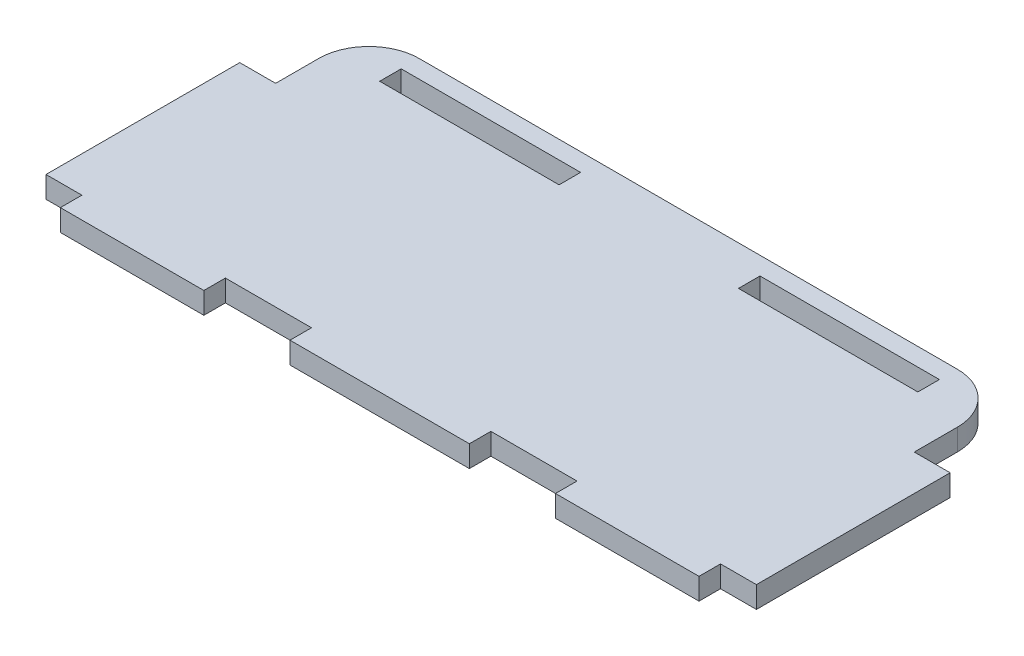
ISO-10303-21;
HEADER;
FILE_DESCRIPTION(('STEP AP214'),'2;1');
FILE_NAME('part.step','',(''),(''),'','','');
FILE_SCHEMA(('AUTOMOTIVE_DESIGN { 1 0 10303 214 1 1 1 1 }'));
ENDSEC;
DATA;
#1=APPLICATION_CONTEXT('core data for automotive mechanical design processes');
#2=APPLICATION_PROTOCOL_DEFINITION('international standard','automotive_design',2000,#1);
#3=PRODUCT_CONTEXT('',#1,'mechanical');
#4=PRODUCT('Part','Part','',(#3));
#5=PRODUCT_RELATED_PRODUCT_CATEGORY('part','',(#4));
#6=PRODUCT_DEFINITION_FORMATION('','',#4);
#7=PRODUCT_DEFINITION_CONTEXT('part definition',#1,'design');
#8=PRODUCT_DEFINITION('design','',#6,#7);
#9=PRODUCT_DEFINITION_SHAPE('','',#8);
#10=(LENGTH_UNIT() NAMED_UNIT(*) SI_UNIT(.MILLI.,.METRE.));
#11=(NAMED_UNIT(*) PLANE_ANGLE_UNIT() SI_UNIT($,.RADIAN.));
#12=(NAMED_UNIT(*) SI_UNIT($,.STERADIAN.) SOLID_ANGLE_UNIT());
#13=UNCERTAINTY_MEASURE_WITH_UNIT(LENGTH_MEASURE(1.E-05),#10,'distance_accuracy_value','');
#14=(GEOMETRIC_REPRESENTATION_CONTEXT(3) GLOBAL_UNCERTAINTY_ASSIGNED_CONTEXT((#13)) GLOBAL_UNIT_ASSIGNED_CONTEXT((#10,
#11,#12)) REPRESENTATION_CONTEXT('',''));
#15=CARTESIAN_POINT('',(0.,0.,0.));
#16=DIRECTION('',(0.,0.,1.));
#17=DIRECTION('',(1.,0.,0.));
#18=AXIS2_PLACEMENT_3D('',#15,#16,#17);
#19=CARTESIAN_POINT('',(-44.5,-24.,119.050547443573));
#20=DIRECTION('',(1.,0.,0.));
#21=DIRECTION('',(0.,1.,0.));
#22=AXIS2_PLACEMENT_3D('',#19,#20,#21);
#23=PLANE('',#22);
#24=DIRECTION('',(0.,0.,-1.));
#25=VECTOR('',#24,1.);
#26=CARTESIAN_POINT('',(-44.5,-21.,119.050547443573));
#27=LINE('',#26,#25);
#28=CARTESIAN_POINT('',(-44.5,-21.0000000000001,0.));
#29=VERTEX_POINT('',#28);
#30=CARTESIAN_POINT('',(-44.5,-21.,-5.99999999999994));
#31=VERTEX_POINT('',#30);
#32=EDGE_CURVE('E374',#29,#31,#27,.T.);
#33=ORIENTED_EDGE('',*,*,#32,.T.);
#34=DIRECTION('',(0.,1.,0.));
#35=VECTOR('',#34,1.);
#36=CARTESIAN_POINT('',(-44.5,-24.,-5.99999999999999));
#37=LINE('',#36,#35);
#38=CARTESIAN_POINT('',(-44.5,-24.,-5.99999999999994));
#39=VERTEX_POINT('',#38);
#40=EDGE_CURVE('E58',#31,#39,#37,.F.);
#41=ORIENTED_EDGE('',*,*,#40,.T.);
#42=DIRECTION('',(0.,0.,-1.));
#43=VECTOR('',#42,1.);
#44=CARTESIAN_POINT('',(-44.5,-24.,119.050547443573));
#45=LINE('',#44,#43);
#46=CARTESIAN_POINT('',(-44.5,-24.0000000000001,0.));
#47=VERTEX_POINT('',#46);
#48=EDGE_CURVE('E364',#47,#39,#45,.T.);
#49=ORIENTED_EDGE('',*,*,#48,.F.);
#50=DIRECTION('',(0.,1.,0.));
#51=VECTOR('',#50,1.);
#52=CARTESIAN_POINT('',(-44.5,-21.0000000000001,0.));
#53=LINE('',#52,#51);
#54=EDGE_CURVE('E298',#47,#29,#53,.T.);
#55=ORIENTED_EDGE('',*,*,#54,.T.);
#56=EDGE_LOOP('',(#33,#41,#49,#55));
#57=FACE_BOUND('',#56,.T.);
#58=ADVANCED_FACE('F35',(#57),#23,.F.);
#59=CARTESIAN_POINT('',(44.5,-24.,119.050547443573));
#60=DIRECTION('',(-1.,0.,0.));
#61=DIRECTION('',(0.,-1.,0.));
#62=AXIS2_PLACEMENT_3D('',#59,#60,#61);
#63=PLANE('',#62);
#64=DIRECTION('',(0.,0.,-1.));
#65=VECTOR('',#64,1.);
#66=CARTESIAN_POINT('',(44.5,-24.,119.050547443573));
#67=LINE('',#66,#65);
#68=CARTESIAN_POINT('',(44.5,-24.,0.));
#69=VERTEX_POINT('',#68);
#70=CARTESIAN_POINT('',(44.5,-24.,-5.99999999999994));
#71=VERTEX_POINT('',#70);
#72=EDGE_CURVE('E406',#69,#71,#67,.T.);
#73=ORIENTED_EDGE('',*,*,#72,.T.);
#74=DIRECTION('',(0.,-1.,0.));
#75=VECTOR('',#74,1.);
#76=CARTESIAN_POINT('',(44.5,-24.,-5.99999999999999));
#77=LINE('',#76,#75);
#78=CARTESIAN_POINT('',(44.5,-21.,-5.99999999999994));
#79=VERTEX_POINT('',#78);
#80=EDGE_CURVE('E11',#71,#79,#77,.F.);
#81=ORIENTED_EDGE('',*,*,#80,.T.);
#82=DIRECTION('',(0.,0.,-1.));
#83=VECTOR('',#82,1.);
#84=CARTESIAN_POINT('',(44.5,-21.,119.050547443573));
#85=LINE('',#84,#83);
#86=CARTESIAN_POINT('',(44.5,-21.,0.));
#87=VERTEX_POINT('',#86);
#88=EDGE_CURVE('E380',#87,#79,#85,.T.);
#89=ORIENTED_EDGE('',*,*,#88,.F.);
#90=DIRECTION('',(0.,1.,0.));
#91=VECTOR('',#90,1.);
#92=CARTESIAN_POINT('',(44.5,-21.0000000000001,0.));
#93=LINE('',#92,#91);
#94=EDGE_CURVE('E325',#69,#87,#93,.T.);
#95=ORIENTED_EDGE('',*,*,#94,.F.);
#96=EDGE_LOOP('',(#73,#81,#89,#95));
#97=FACE_BOUND('',#96,.T.);
#98=ADVANCED_FACE('F555',(#97),#63,.F.);
#99=DIRECTION('',(0.,-1.,0.));
#100=VECTOR('',#99,1.);
#101=CARTESIAN_POINT('',(44.5,-21.0000000000001,27.));
#102=LINE('',#101,#100);
#103=CARTESIAN_POINT('',(44.5,-21.,27.0000000000001));
#104=VERTEX_POINT('',#103);
#105=CARTESIAN_POINT('',(44.5,-24.0000000000001,27.));
#106=VERTEX_POINT('',#105);
#107=EDGE_CURVE('E445',#104,#106,#102,.T.);
#108=ORIENTED_EDGE('',*,*,#107,.F.);
#109=CARTESIAN_POINT('',(44.5,-21.,30.));
#110=VERTEX_POINT('',#109);
#111=EDGE_CURVE('E403',#110,#104,#85,.T.);
#112=ORIENTED_EDGE('',*,*,#111,.F.);
#113=DIRECTION('',(0.,-1.,0.));
#114=VECTOR('',#113,1.);
#115=CARTESIAN_POINT('',(44.5,-24.,30.));
#116=LINE('',#115,#114);
#117=CARTESIAN_POINT('',(44.5,-24.,30.));
#118=VERTEX_POINT('',#117);
#119=EDGE_CURVE('E426',#110,#118,#116,.T.);
#120=ORIENTED_EDGE('',*,*,#119,.T.);
#121=EDGE_CURVE('E755',#118,#106,#67,.T.);
#122=ORIENTED_EDGE('',*,*,#121,.T.);
#123=EDGE_LOOP('',(#108,#112,#120,#122));
#124=FACE_BOUND('',#123,.T.);
#125=ADVANCED_FACE('F560',(#124),#63,.F.);
#126=CARTESIAN_POINT('',(0.,-35.5,30.));
#127=DIRECTION('',(0.,0.,-1.));
#128=DIRECTION('',(-1.,0.,0.));
#129=AXIS2_PLACEMENT_3D('',#126,#127,#128);
#130=PLANE('',#129);
#131=DIRECTION('',(1.,0.,0.));
#132=VECTOR('',#131,1.);
#133=CARTESIAN_POINT('',(-44.5,-21.,30.));
#134=LINE('',#133,#132);
#135=CARTESIAN_POINT('',(-12.5,-21.,30.));
#136=VERTEX_POINT('',#135);
#137=CARTESIAN_POINT('',(12.5,-21.,30.));
#138=VERTEX_POINT('',#137);
#139=EDGE_CURVE('E427',#136,#138,#134,.T.);
#140=ORIENTED_EDGE('',*,*,#139,.F.);
#141=DIRECTION('',(0.,-1.,0.));
#142=VECTOR('',#141,1.);
#143=CARTESIAN_POINT('',(-12.5,-35.5,30.));
#144=LINE('',#143,#142);
#145=CARTESIAN_POINT('',(-12.5,-24.,30.));
#146=VERTEX_POINT('',#145);
#147=EDGE_CURVE('E409',#136,#146,#144,.T.);
#148=ORIENTED_EDGE('',*,*,#147,.T.);
#149=DIRECTION('',(-1.,0.,0.));
#150=VECTOR('',#149,1.);
#151=CARTESIAN_POINT('',(-44.5,-24.,30.));
#152=LINE('',#151,#150);
#153=CARTESIAN_POINT('',(12.5,-24.,30.));
#154=VERTEX_POINT('',#153);
#155=EDGE_CURVE('E515',#154,#146,#152,.T.);
#156=ORIENTED_EDGE('',*,*,#155,.F.);
#157=DIRECTION('',(0.,1.,0.));
#158=VECTOR('',#157,1.);
#159=CARTESIAN_POINT('',(12.5,-35.5,30.));
#160=LINE('',#159,#158);
#161=EDGE_CURVE('E421',#154,#138,#160,.T.);
#162=ORIENTED_EDGE('',*,*,#161,.T.);
#163=EDGE_LOOP('',(#140,#148,#156,#162));
#164=FACE_BOUND('',#163,.T.);
#165=ADVANCED_FACE('F571',(#164),#130,.F.);
#166=CARTESIAN_POINT('',(24.5,-21.,30.));
#167=VERTEX_POINT('',#166);
#168=EDGE_CURVE('E428',#167,#110,#134,.T.);
#169=ORIENTED_EDGE('',*,*,#168,.F.);
#170=DIRECTION('',(0.,-1.,0.));
#171=VECTOR('',#170,1.);
#172=CARTESIAN_POINT('',(24.5,-35.5,30.));
#173=LINE('',#172,#171);
#174=CARTESIAN_POINT('',(24.5,-24.,30.));
#175=VERTEX_POINT('',#174);
#176=EDGE_CURVE('E418',#167,#175,#173,.T.);
#177=ORIENTED_EDGE('',*,*,#176,.T.);
#178=EDGE_CURVE('E513',#118,#175,#152,.T.);
#179=ORIENTED_EDGE('',*,*,#178,.F.);
#180=ORIENTED_EDGE('',*,*,#119,.F.);
#181=EDGE_LOOP('',(#169,#177,#179,#180));
#182=FACE_BOUND('',#181,.T.);
#183=ADVANCED_FACE('F572',(#182),#130,.F.);
#184=CARTESIAN_POINT('',(-44.5,-21.,119.050547443573));
#185=DIRECTION('',(0.,-1.,0.));
#186=DIRECTION('',(0.,0.,-1.));
#187=AXIS2_PLACEMENT_3D('',#184,#185,#186);
#188=PLANE('',#187);
#189=DIRECTION('',(1.,0.,0.));
#190=VECTOR('',#189,1.);
#191=CARTESIAN_POINT('',(12.5,-21.,-7.5));
#192=LINE('',#191,#190);
#193=CARTESIAN_POINT('',(12.5,-21.,-7.49999999999999));
#194=VERTEX_POINT('',#193);
#195=CARTESIAN_POINT('',(37.5,-21.,-7.5));
#196=VERTEX_POINT('',#195);
#197=EDGE_CURVE('E250',#194,#196,#192,.T.);
#198=ORIENTED_EDGE('',*,*,#197,.F.);
#199=DIRECTION('',(0.,0.,1.));
#200=VECTOR('',#199,1.);
#201=CARTESIAN_POINT('',(12.5,-21.,-10.5));
#202=LINE('',#201,#200);
#203=CARTESIAN_POINT('',(12.5,-21.,-10.5));
#204=VERTEX_POINT('',#203);
#205=EDGE_CURVE('E255',#204,#194,#202,.T.);
#206=ORIENTED_EDGE('',*,*,#205,.F.);
#207=DIRECTION('',(-1.,0.,0.));
#208=VECTOR('',#207,1.);
#209=CARTESIAN_POINT('',(12.5,-21.,-10.5));
#210=LINE('',#209,#208);
#211=CARTESIAN_POINT('',(37.5,-21.,-10.5));
#212=VERTEX_POINT('',#211);
#213=EDGE_CURVE('E260',#212,#204,#210,.T.);
#214=ORIENTED_EDGE('',*,*,#213,.F.);
#215=DIRECTION('',(0.,0.,-1.));
#216=VECTOR('',#215,1.);
#217=CARTESIAN_POINT('',(37.5,-21.,-10.5));
#218=LINE('',#217,#216);
#219=EDGE_CURVE('E239',#196,#212,#218,.T.);
#220=ORIENTED_EDGE('',*,*,#219,.F.);
#221=EDGE_LOOP('',(#198,#206,#214,#220));
#222=FACE_BOUND('',#221,.T.);
#223=DIRECTION('',(1.,0.,0.));
#224=VECTOR('',#223,1.);
#225=CARTESIAN_POINT('',(-37.5,-21.,-7.5));
#226=LINE('',#225,#224);
#227=CARTESIAN_POINT('',(-37.5,-21.,-7.49999999999999));
#228=VERTEX_POINT('',#227);
#229=CARTESIAN_POINT('',(-12.5,-21.,-7.5));
#230=VERTEX_POINT('',#229);
#231=EDGE_CURVE('E272',#228,#230,#226,.T.);
#232=ORIENTED_EDGE('',*,*,#231,.F.);
#233=DIRECTION('',(0.,0.,1.));
#234=VECTOR('',#233,1.);
#235=CARTESIAN_POINT('',(-37.5,-21.,-10.5));
#236=LINE('',#235,#234);
#237=CARTESIAN_POINT('',(-37.5,-21.,-10.5));
#238=VERTEX_POINT('',#237);
#239=EDGE_CURVE('E268',#238,#228,#236,.T.);
#240=ORIENTED_EDGE('',*,*,#239,.F.);
#241=DIRECTION('',(-1.,0.,0.));
#242=VECTOR('',#241,1.);
#243=CARTESIAN_POINT('',(-37.5,-21.,-10.5));
#244=LINE('',#243,#242);
#245=CARTESIAN_POINT('',(-12.5,-21.,-10.5));
#246=VERTEX_POINT('',#245);
#247=EDGE_CURVE('E278',#246,#238,#244,.T.);
#248=ORIENTED_EDGE('',*,*,#247,.F.);
#249=DIRECTION('',(0.,0.,-1.));
#250=VECTOR('',#249,1.);
#251=CARTESIAN_POINT('',(-12.5,-21.,-10.5));
#252=LINE('',#251,#250);
#253=EDGE_CURVE('E275',#230,#246,#252,.T.);
#254=ORIENTED_EDGE('',*,*,#253,.F.);
#255=EDGE_LOOP('',(#232,#240,#248,#254));
#256=FACE_BOUND('',#255,.T.);
#257=DIRECTION('',(1.,0.,0.));
#258=VECTOR('',#257,1.);
#259=CARTESIAN_POINT('',(-44.5,-21.,-13.));
#260=LINE('',#259,#258);
#261=CARTESIAN_POINT('',(-37.5,-21.,-13.));
#262=VERTEX_POINT('',#261);
#263=CARTESIAN_POINT('',(37.5,-21.,-13.));
#264=VERTEX_POINT('',#263);
#265=EDGE_CURVE('E284',#262,#264,#260,.T.);
#266=ORIENTED_EDGE('',*,*,#265,.F.);
#267=CARTESIAN_POINT('',(-37.5,-21.,-6.));
#268=DIRECTION('',(0.,-1.,0.));
#269=DIRECTION('',(0.,0.,-1.));
#270=AXIS2_PLACEMENT_3D('',#267,#268,#269);
#271=CIRCLE('',#270,7.);
#272=EDGE_CURVE('E359',#262,#31,#271,.F.);
#273=ORIENTED_EDGE('',*,*,#272,.T.);
#274=ORIENTED_EDGE('',*,*,#32,.F.);
#275=DIRECTION('',(1.,0.,0.));
#276=VECTOR('',#275,1.);
#277=CARTESIAN_POINT('',(-49.5,-21.0000000000001,0.));
#278=LINE('',#277,#276);
#279=CARTESIAN_POINT('',(-49.5,-21.0000000000001,0.));
#280=VERTEX_POINT('',#279);
#281=EDGE_CURVE('E312',#280,#29,#278,.T.);
#282=ORIENTED_EDGE('',*,*,#281,.F.);
#283=DIRECTION('',(0.,0.,1.));
#284=VECTOR('',#283,1.);
#285=CARTESIAN_POINT('',(-49.5,-21.0000000000001,0.));
#286=LINE('',#285,#284);
#287=CARTESIAN_POINT('',(-49.5,-21.0000000000001,27.));
#288=VERTEX_POINT('',#287);
#289=EDGE_CURVE('E309',#280,#288,#286,.T.);
#290=ORIENTED_EDGE('',*,*,#289,.T.);
#291=DIRECTION('',(1.,0.,0.));
#292=VECTOR('',#291,1.);
#293=CARTESIAN_POINT('',(-49.5,-21.0000000000001,27.));
#294=LINE('',#293,#292);
#295=CARTESIAN_POINT('',(-44.5,-21.0000000000001,27.));
#296=VERTEX_POINT('',#295);
#297=EDGE_CURVE('E531',#288,#296,#294,.T.);
#298=ORIENTED_EDGE('',*,*,#297,.T.);
#299=CARTESIAN_POINT('',(-44.5,-21.,30.));
#300=VERTEX_POINT('',#299);
#301=EDGE_CURVE('E376',#300,#296,#27,.T.);
#302=ORIENTED_EDGE('',*,*,#301,.F.);
#303=CARTESIAN_POINT('',(-24.5,-21.,30.));
#304=VERTEX_POINT('',#303);
#305=EDGE_CURVE('E424',#300,#304,#134,.T.);
#306=ORIENTED_EDGE('',*,*,#305,.T.);
#307=DIRECTION('',(0.,0.,1.));
#308=VECTOR('',#307,1.);
#309=CARTESIAN_POINT('',(-24.5,-21.,30.));
#310=LINE('',#309,#308);
#311=CARTESIAN_POINT('',(-24.5,-21.,27.));
#312=VERTEX_POINT('',#311);
#313=EDGE_CURVE('E480',#312,#304,#310,.T.);
#314=ORIENTED_EDGE('',*,*,#313,.F.);
#315=DIRECTION('',(-1.,0.,0.));
#316=VECTOR('',#315,1.);
#317=CARTESIAN_POINT('',(-12.5,-21.,27.));
#318=LINE('',#317,#316);
#319=CARTESIAN_POINT('',(-12.5,-21.,27.));
#320=VERTEX_POINT('',#319);
#321=EDGE_CURVE('E474',#320,#312,#318,.T.);
#322=ORIENTED_EDGE('',*,*,#321,.F.);
#323=DIRECTION('',(0.,0.,-1.));
#324=VECTOR('',#323,1.);
#325=CARTESIAN_POINT('',(-12.5,-21.,30.));
#326=LINE('',#325,#324);
#327=EDGE_CURVE('E454',#136,#320,#326,.T.);
#328=ORIENTED_EDGE('',*,*,#327,.F.);
#329=ORIENTED_EDGE('',*,*,#139,.T.);
#330=DIRECTION('',(0.,0.,1.));
#331=VECTOR('',#330,1.);
#332=CARTESIAN_POINT('',(12.5,-21.,30.));
#333=LINE('',#332,#331);
#334=CARTESIAN_POINT('',(12.5,-21.,27.));
#335=VERTEX_POINT('',#334);
#336=EDGE_CURVE('E502',#335,#138,#333,.T.);
#337=ORIENTED_EDGE('',*,*,#336,.F.);
#338=DIRECTION('',(-1.,0.,0.));
#339=VECTOR('',#338,1.);
#340=CARTESIAN_POINT('',(24.5,-21.,27.));
#341=LINE('',#340,#339);
#342=CARTESIAN_POINT('',(24.5,-21.,27.));
#343=VERTEX_POINT('',#342);
#344=EDGE_CURVE('E499',#343,#335,#341,.T.);
#345=ORIENTED_EDGE('',*,*,#344,.F.);
#346=DIRECTION('',(0.,0.,-1.));
#347=VECTOR('',#346,1.);
#348=CARTESIAN_POINT('',(24.5,-21.,30.));
#349=LINE('',#348,#347);
#350=EDGE_CURVE('E496',#167,#343,#349,.T.);
#351=ORIENTED_EDGE('',*,*,#350,.F.);
#352=ORIENTED_EDGE('',*,*,#168,.T.);
#353=ORIENTED_EDGE('',*,*,#111,.T.);
#354=DIRECTION('',(-1.,0.,0.));
#355=VECTOR('',#354,1.);
#356=CARTESIAN_POINT('',(49.5,-21.0000000000001,27.));
#357=LINE('',#356,#355);
#358=CARTESIAN_POINT('',(49.5,-21.0000000000001,27.));
#359=VERTEX_POINT('',#358);
#360=EDGE_CURVE('E463',#359,#104,#357,.T.);
#361=ORIENTED_EDGE('',*,*,#360,.F.);
#362=DIRECTION('',(0.,0.,1.));
#363=VECTOR('',#362,1.);
#364=CARTESIAN_POINT('',(49.5,-21.0000000000001,0.));
#365=LINE('',#364,#363);
#366=CARTESIAN_POINT('',(49.5,-21.0000000000001,0.));
#367=VERTEX_POINT('',#366);
#368=EDGE_CURVE('E766',#367,#359,#365,.T.);
#369=ORIENTED_EDGE('',*,*,#368,.F.);
#370=DIRECTION('',(-1.,0.,0.));
#371=VECTOR('',#370,1.);
#372=CARTESIAN_POINT('',(49.5,-21.0000000000001,0.));
#373=LINE('',#372,#371);
#374=EDGE_CURVE('E468',#367,#87,#373,.T.);
#375=ORIENTED_EDGE('',*,*,#374,.T.);
#376=ORIENTED_EDGE('',*,*,#88,.T.);
#377=CARTESIAN_POINT('',(37.5,-21.,-6.));
#378=DIRECTION('',(0.,-1.,0.));
#379=DIRECTION('',(0.,0.,-1.));
#380=AXIS2_PLACEMENT_3D('',#377,#378,#379);
#381=CIRCLE('',#380,7.);
#382=EDGE_CURVE('E357',#79,#264,#381,.F.);
#383=ORIENTED_EDGE('',*,*,#382,.T.);
#384=EDGE_LOOP('',(#266,#273,#274,#282,#290,#298,#302,#306,#314,#322,#328,#329,#337,#345,#351,
#352,#353,#361,#369,#375,#376,#383));
#385=FACE_BOUND('',#384,.T.);
#386=ADVANCED_FACE('F257',(#222,#256,#385),#188,.F.);
#387=CARTESIAN_POINT('',(-44.5,-24.,119.050547443573));
#388=DIRECTION('',(0.,1.,0.));
#389=DIRECTION('',(0.,0.,1.));
#390=AXIS2_PLACEMENT_3D('',#387,#388,#389);
#391=PLANE('',#390);
#392=DIRECTION('',(-1.,0.,0.));
#393=VECTOR('',#392,1.);
#394=CARTESIAN_POINT('',(-44.5,-24.,-10.5));
#395=LINE('',#394,#393);
#396=CARTESIAN_POINT('',(37.5,-24.,-10.5));
#397=VERTEX_POINT('',#396);
#398=CARTESIAN_POINT('',(12.5,-24.,-10.5));
#399=VERTEX_POINT('',#398);
#400=EDGE_CURVE('E345',#397,#399,#395,.T.);
#401=ORIENTED_EDGE('',*,*,#400,.T.);
#402=DIRECTION('',(0.,0.,1.));
#403=VECTOR('',#402,1.);
#404=CARTESIAN_POINT('',(12.5,-24.,119.050547443573));
#405=LINE('',#404,#403);
#406=CARTESIAN_POINT('',(12.5,-24.,-7.5));
#407=VERTEX_POINT('',#406);
#408=EDGE_CURVE('E348',#399,#407,#405,.T.);
#409=ORIENTED_EDGE('',*,*,#408,.T.);
#410=DIRECTION('',(1.,0.,0.));
#411=VECTOR('',#410,1.);
#412=CARTESIAN_POINT('',(-44.5,-24.,-7.49999999999999));
#413=LINE('',#412,#411);
#414=CARTESIAN_POINT('',(37.5,-24.,-7.49999999999999));
#415=VERTEX_POINT('',#414);
#416=EDGE_CURVE('E342',#407,#415,#413,.T.);
#417=ORIENTED_EDGE('',*,*,#416,.T.);
#418=DIRECTION('',(0.,0.,-1.));
#419=VECTOR('',#418,1.);
#420=CARTESIAN_POINT('',(37.5,-24.,119.050547443573));
#421=LINE('',#420,#419);
#422=EDGE_CURVE('E242',#415,#397,#421,.T.);
#423=ORIENTED_EDGE('',*,*,#422,.T.);
#424=EDGE_LOOP('',(#401,#409,#417,#423));
#425=FACE_BOUND('',#424,.T.);
#426=DIRECTION('',(-1.,0.,0.));
#427=VECTOR('',#426,1.);
#428=CARTESIAN_POINT('',(-44.5,-24.,-10.5));
#429=LINE('',#428,#427);
#430=CARTESIAN_POINT('',(-12.5,-24.,-10.5));
#431=VERTEX_POINT('',#430);
#432=CARTESIAN_POINT('',(-37.5,-24.,-10.5));
#433=VERTEX_POINT('',#432);
#434=EDGE_CURVE('E336',#431,#433,#429,.T.);
#435=ORIENTED_EDGE('',*,*,#434,.T.);
#436=DIRECTION('',(0.,0.,1.));
#437=VECTOR('',#436,1.);
#438=CARTESIAN_POINT('',(-37.5,-24.,119.050547443573));
#439=LINE('',#438,#437);
#440=CARTESIAN_POINT('',(-37.5,-24.,-7.5));
#441=VERTEX_POINT('',#440);
#442=EDGE_CURVE('E339',#433,#441,#439,.T.);
#443=ORIENTED_EDGE('',*,*,#442,.T.);
#444=DIRECTION('',(1.,0.,0.));
#445=VECTOR('',#444,1.);
#446=CARTESIAN_POINT('',(-44.5,-24.,-7.49999999999999));
#447=LINE('',#446,#445);
#448=CARTESIAN_POINT('',(-12.5,-24.,-7.49999999999999));
#449=VERTEX_POINT('',#448);
#450=EDGE_CURVE('E329',#441,#449,#447,.T.);
#451=ORIENTED_EDGE('',*,*,#450,.T.);
#452=DIRECTION('',(0.,0.,-1.));
#453=VECTOR('',#452,1.);
#454=CARTESIAN_POINT('',(-12.5,-24.,119.050547443573));
#455=LINE('',#454,#453);
#456=EDGE_CURVE('E332',#449,#431,#455,.T.);
#457=ORIENTED_EDGE('',*,*,#456,.T.);
#458=EDGE_LOOP('',(#435,#443,#451,#457));
#459=FACE_BOUND('',#458,.T.);
#460=ORIENTED_EDGE('',*,*,#48,.T.);
#461=CARTESIAN_POINT('',(-37.5,-24.,-6.));
#462=DIRECTION('',(0.,1.,0.));
#463=DIRECTION('',(0.,0.,1.));
#464=AXIS2_PLACEMENT_3D('',#461,#462,#463);
#465=CIRCLE('',#464,7.);
#466=CARTESIAN_POINT('',(-37.5,-24.,-13.));
#467=VERTEX_POINT('',#466);
#468=EDGE_CURVE('E43',#39,#467,#465,.F.);
#469=ORIENTED_EDGE('',*,*,#468,.T.);
#470=DIRECTION('',(-1.,0.,0.));
#471=VECTOR('',#470,1.);
#472=CARTESIAN_POINT('',(-44.5,-24.,-13.));
#473=LINE('',#472,#471);
#474=CARTESIAN_POINT('',(37.5,-24.,-13.));
#475=VERTEX_POINT('',#474);
#476=EDGE_CURVE('E294',#475,#467,#473,.T.);
#477=ORIENTED_EDGE('',*,*,#476,.F.);
#478=CARTESIAN_POINT('',(37.5,-24.,-6.));
#479=DIRECTION('',(0.,1.,0.));
#480=DIRECTION('',(0.,0.,1.));
#481=AXIS2_PLACEMENT_3D('',#478,#479,#480);
#482=CIRCLE('',#481,7.);
#483=EDGE_CURVE('E50',#475,#71,#482,.F.);
#484=ORIENTED_EDGE('',*,*,#483,.T.);
#485=ORIENTED_EDGE('',*,*,#72,.F.);
#486=DIRECTION('',(-1.,0.,0.));
#487=VECTOR('',#486,1.);
#488=CARTESIAN_POINT('',(49.5,-24.0000000000001,0.));
#489=LINE('',#488,#487);
#490=CARTESIAN_POINT('',(49.5,-24.0000000000001,0.));
#491=VERTEX_POINT('',#490);
#492=EDGE_CURVE('E437',#491,#69,#489,.T.);
#493=ORIENTED_EDGE('',*,*,#492,.F.);
#494=DIRECTION('',(0.,0.,-1.));
#495=VECTOR('',#494,1.);
#496=CARTESIAN_POINT('',(49.5,-24.0000000000001,0.));
#497=LINE('',#496,#495);
#498=CARTESIAN_POINT('',(49.5,-24.0000000000001,27.));
#499=VERTEX_POINT('',#498);
#500=EDGE_CURVE('E441',#499,#491,#497,.T.);
#501=ORIENTED_EDGE('',*,*,#500,.F.);
#502=DIRECTION('',(-1.,0.,0.));
#503=VECTOR('',#502,1.);
#504=CARTESIAN_POINT('',(49.5,-24.0000000000001,27.));
#505=LINE('',#504,#503);
#506=EDGE_CURVE('E440',#499,#106,#505,.T.);
#507=ORIENTED_EDGE('',*,*,#506,.T.);
#508=ORIENTED_EDGE('',*,*,#121,.F.);
#509=ORIENTED_EDGE('',*,*,#178,.T.);
#510=DIRECTION('',(0.,0.,-1.));
#511=VECTOR('',#510,1.);
#512=CARTESIAN_POINT('',(24.5000000000002,-24.,119.050547443573));
#513=LINE('',#512,#511);
#514=CARTESIAN_POINT('',(24.5,-24.,27.));
#515=VERTEX_POINT('',#514);
#516=EDGE_CURVE('E377',#175,#515,#513,.T.);
#517=ORIENTED_EDGE('',*,*,#516,.T.);
#518=DIRECTION('',(-1.,0.,0.));
#519=VECTOR('',#518,1.);
#520=CARTESIAN_POINT('',(-44.5000000000001,-24.,27.0000000000001));
#521=LINE('',#520,#519);
#522=CARTESIAN_POINT('',(12.5,-24.,27.));
#523=VERTEX_POINT('',#522);
#524=EDGE_CURVE('E415',#515,#523,#521,.T.);
#525=ORIENTED_EDGE('',*,*,#524,.T.);
#526=DIRECTION('',(0.,0.,1.));
#527=VECTOR('',#526,1.);
#528=CARTESIAN_POINT('',(12.5,-24.,119.050547443573));
#529=LINE('',#528,#527);
#530=EDGE_CURVE('E383',#523,#154,#529,.T.);
#531=ORIENTED_EDGE('',*,*,#530,.T.);
#532=ORIENTED_EDGE('',*,*,#155,.T.);
#533=DIRECTION('',(0.,0.,-1.));
#534=VECTOR('',#533,1.);
#535=CARTESIAN_POINT('',(-12.5000000000001,-24.,119.050547443573));
#536=LINE('',#535,#534);
#537=CARTESIAN_POINT('',(-12.5,-24.,27.));
#538=VERTEX_POINT('',#537);
#539=EDGE_CURVE('E493',#146,#538,#536,.T.);
#540=ORIENTED_EDGE('',*,*,#539,.T.);
#541=DIRECTION('',(-1.,0.,0.));
#542=VECTOR('',#541,1.);
#543=CARTESIAN_POINT('',(-44.5,-24.,27.));
#544=LINE('',#543,#542);
#545=CARTESIAN_POINT('',(-24.5,-24.,27.));
#546=VERTEX_POINT('',#545);
#547=EDGE_CURVE('E333',#538,#546,#544,.T.);
#548=ORIENTED_EDGE('',*,*,#547,.T.);
#549=DIRECTION('',(0.,0.,1.));
#550=VECTOR('',#549,1.);
#551=CARTESIAN_POINT('',(-24.5,-24.,119.050547443573));
#552=LINE('',#551,#550);
#553=CARTESIAN_POINT('',(-24.5,-24.,30.));
#554=VERTEX_POINT('',#553);
#555=EDGE_CURVE('E489',#546,#554,#552,.T.);
#556=ORIENTED_EDGE('',*,*,#555,.T.);
#557=CARTESIAN_POINT('',(-44.5,-24.,30.));
#558=VERTEX_POINT('',#557);
#559=EDGE_CURVE('E512',#554,#558,#152,.T.);
#560=ORIENTED_EDGE('',*,*,#559,.T.);
#561=CARTESIAN_POINT('',(-44.5,-24.,27.0000000000001));
#562=VERTEX_POINT('',#561);
#563=EDGE_CURVE('E432',#558,#562,#45,.T.);
#564=ORIENTED_EDGE('',*,*,#563,.T.);
#565=DIRECTION('',(1.,0.,0.));
#566=VECTOR('',#565,1.);
#567=CARTESIAN_POINT('',(-49.5,-24.0000000000001,27.));
#568=LINE('',#567,#566);
#569=CARTESIAN_POINT('',(-49.5,-24.0000000000001,27.));
#570=VERTEX_POINT('',#569);
#571=EDGE_CURVE('E326',#570,#562,#568,.T.);
#572=ORIENTED_EDGE('',*,*,#571,.F.);
#573=DIRECTION('',(0.,0.,-1.));
#574=VECTOR('',#573,1.);
#575=CARTESIAN_POINT('',(-49.5,-24.0000000000001,0.));
#576=LINE('',#575,#574);
#577=CARTESIAN_POINT('',(-49.5,-24.0000000000001,0.));
#578=VERTEX_POINT('',#577);
#579=EDGE_CURVE('E302',#570,#578,#576,.T.);
#580=ORIENTED_EDGE('',*,*,#579,.T.);
#581=DIRECTION('',(1.,0.,0.));
#582=VECTOR('',#581,1.);
#583=CARTESIAN_POINT('',(-49.5,-24.0000000000001,0.));
#584=LINE('',#583,#582);
#585=EDGE_CURVE('E323',#578,#47,#584,.T.);
#586=ORIENTED_EDGE('',*,*,#585,.T.);
#587=EDGE_LOOP('',(#460,#469,#477,#484,#485,#493,#501,#507,#508,#509,#517,#525,#531,#532,#540,
#548,#556,#560,#564,#572,#580,#586));
#588=FACE_BOUND('',#587,.T.);
#589=ADVANCED_FACE('F363',(#425,#459,#588),#391,.F.);
#590=ORIENTED_EDGE('',*,*,#301,.T.);
#591=DIRECTION('',(0.,-1.,0.));
#592=VECTOR('',#591,1.);
#593=CARTESIAN_POINT('',(-44.5,-21.0000000000001,27.));
#594=LINE('',#593,#592);
#595=EDGE_CURVE('E303',#296,#562,#594,.T.);
#596=ORIENTED_EDGE('',*,*,#595,.T.);
#597=ORIENTED_EDGE('',*,*,#563,.F.);
#598=DIRECTION('',(0.,1.,0.));
#599=VECTOR('',#598,1.);
#600=CARTESIAN_POINT('',(-44.5,-24.,30.));
#601=LINE('',#600,#599);
#602=EDGE_CURVE('E392',#558,#300,#601,.T.);
#603=ORIENTED_EDGE('',*,*,#602,.T.);
#604=EDGE_LOOP('',(#590,#596,#597,#603));
#605=FACE_BOUND('',#604,.T.);
#606=ADVANCED_FACE('F527',(#605),#23,.F.);
#607=ORIENTED_EDGE('',*,*,#559,.F.);
#608=DIRECTION('',(0.,1.,0.));
#609=VECTOR('',#608,1.);
#610=CARTESIAN_POINT('',(-24.5,-35.5,30.));
#611=LINE('',#610,#609);
#612=EDGE_CURVE('E412',#554,#304,#611,.T.);
#613=ORIENTED_EDGE('',*,*,#612,.T.);
#614=ORIENTED_EDGE('',*,*,#305,.F.);
#615=ORIENTED_EDGE('',*,*,#602,.F.);
#616=EDGE_LOOP('',(#607,#613,#614,#615));
#617=FACE_BOUND('',#616,.T.);
#618=ADVANCED_FACE('F523',(#617),#130,.F.);
#619=CARTESIAN_POINT('',(24.5,-31.,27.));
#620=DIRECTION('',(0.,0.,-1.));
#621=DIRECTION('',(-1.,0.,0.));
#622=AXIS2_PLACEMENT_3D('',#619,#620,#621);
#623=PLANE('',#622);
#624=DIRECTION('',(0.,1.,0.));
#625=VECTOR('',#624,1.);
#626=CARTESIAN_POINT('',(24.5,-31.,27.));
#627=LINE('',#626,#625);
#628=EDGE_CURVE('E505',#515,#343,#627,.T.);
#629=ORIENTED_EDGE('',*,*,#628,.T.);
#630=ORIENTED_EDGE('',*,*,#344,.T.);
#631=DIRECTION('',(0.,1.,0.));
#632=VECTOR('',#631,1.);
#633=CARTESIAN_POINT('',(12.5,-31.,27.));
#634=LINE('',#633,#632);
#635=EDGE_CURVE('E506',#523,#335,#634,.T.);
#636=ORIENTED_EDGE('',*,*,#635,.F.);
#637=ORIENTED_EDGE('',*,*,#524,.F.);
#638=EDGE_LOOP('',(#629,#630,#636,#637));
#639=FACE_BOUND('',#638,.T.);
#640=ADVANCED_FACE('F569',(#639),#623,.F.);
#641=CARTESIAN_POINT('',(24.5,-31.,30.));
#642=DIRECTION('',(1.,0.,0.));
#643=DIRECTION('',(0.,0.,-1.));
#644=AXIS2_PLACEMENT_3D('',#641,#642,#643);
#645=PLANE('',#644);
#646=ORIENTED_EDGE('',*,*,#176,.F.);
#647=ORIENTED_EDGE('',*,*,#350,.T.);
#648=ORIENTED_EDGE('',*,*,#628,.F.);
#649=ORIENTED_EDGE('',*,*,#516,.F.);
#650=EDGE_LOOP('',(#646,#647,#648,#649));
#651=FACE_BOUND('',#650,.T.);
#652=ADVANCED_FACE('F580',(#651),#645,.F.);
#653=CARTESIAN_POINT('',(12.5,-31.,30.));
#654=DIRECTION('',(-1.,0.,0.));
#655=DIRECTION('',(0.,0.,1.));
#656=AXIS2_PLACEMENT_3D('',#653,#654,#655);
#657=PLANE('',#656);
#658=ORIENTED_EDGE('',*,*,#635,.T.);
#659=ORIENTED_EDGE('',*,*,#336,.T.);
#660=ORIENTED_EDGE('',*,*,#161,.F.);
#661=ORIENTED_EDGE('',*,*,#530,.F.);
#662=EDGE_LOOP('',(#658,#659,#660,#661));
#663=FACE_BOUND('',#662,.T.);
#664=ADVANCED_FACE('F583',(#663),#657,.F.);
#665=CARTESIAN_POINT('',(-12.5,-31.,27.));
#666=DIRECTION('',(0.,0.,-1.));
#667=DIRECTION('',(-1.,0.,0.));
#668=AXIS2_PLACEMENT_3D('',#665,#666,#667);
#669=PLANE('',#668);
#670=DIRECTION('',(0.,1.,0.));
#671=VECTOR('',#670,1.);
#672=CARTESIAN_POINT('',(-12.5,-31.,27.));
#673=LINE('',#672,#671);
#674=EDGE_CURVE('E484',#538,#320,#673,.T.);
#675=ORIENTED_EDGE('',*,*,#674,.T.);
#676=ORIENTED_EDGE('',*,*,#321,.T.);
#677=DIRECTION('',(0.,1.,0.));
#678=VECTOR('',#677,1.);
#679=CARTESIAN_POINT('',(-24.5,-31.,27.));
#680=LINE('',#679,#678);
#681=EDGE_CURVE('E487',#546,#312,#680,.T.);
#682=ORIENTED_EDGE('',*,*,#681,.F.);
#683=ORIENTED_EDGE('',*,*,#547,.F.);
#684=EDGE_LOOP('',(#675,#676,#682,#683));
#685=FACE_BOUND('',#684,.T.);
#686=ADVANCED_FACE('F590',(#685),#669,.F.);
#687=CARTESIAN_POINT('',(-12.5,-31.,30.));
#688=DIRECTION('',(1.,0.,0.));
#689=DIRECTION('',(0.,0.,-1.));
#690=AXIS2_PLACEMENT_3D('',#687,#688,#689);
#691=PLANE('',#690);
#692=ORIENTED_EDGE('',*,*,#147,.F.);
#693=ORIENTED_EDGE('',*,*,#327,.T.);
#694=ORIENTED_EDGE('',*,*,#674,.F.);
#695=ORIENTED_EDGE('',*,*,#539,.F.);
#696=EDGE_LOOP('',(#692,#693,#694,#695));
#697=FACE_BOUND('',#696,.T.);
#698=ADVANCED_FACE('F592',(#697),#691,.F.);
#699=CARTESIAN_POINT('',(-24.5,-31.,30.));
#700=DIRECTION('',(-1.,0.,0.));
#701=DIRECTION('',(0.,0.,1.));
#702=AXIS2_PLACEMENT_3D('',#699,#700,#701);
#703=PLANE('',#702);
#704=ORIENTED_EDGE('',*,*,#681,.T.);
#705=ORIENTED_EDGE('',*,*,#313,.T.);
#706=ORIENTED_EDGE('',*,*,#612,.F.);
#707=ORIENTED_EDGE('',*,*,#555,.F.);
#708=EDGE_LOOP('',(#704,#705,#706,#707));
#709=FACE_BOUND('',#708,.T.);
#710=ADVANCED_FACE('F595',(#709),#703,.F.);
#711=CARTESIAN_POINT('',(49.5,-21.0000000000001,0.));
#712=DIRECTION('',(0.,0.,1.));
#713=DIRECTION('',(1.,0.,0.));
#714=AXIS2_PLACEMENT_3D('',#711,#712,#713);
#715=PLANE('',#714);
#716=ORIENTED_EDGE('',*,*,#94,.T.);
#717=ORIENTED_EDGE('',*,*,#374,.F.);
#718=DIRECTION('',(0.,1.,0.));
#719=VECTOR('',#718,1.);
#720=CARTESIAN_POINT('',(49.5,-21.0000000000001,0.));
#721=LINE('',#720,#719);
#722=EDGE_CURVE('E460',#491,#367,#721,.T.);
#723=ORIENTED_EDGE('',*,*,#722,.F.);
#724=ORIENTED_EDGE('',*,*,#492,.T.);
#725=EDGE_LOOP('',(#716,#717,#723,#724));
#726=FACE_BOUND('',#725,.T.);
#727=ADVANCED_FACE('F600',(#726),#715,.F.);
#728=CARTESIAN_POINT('',(49.5,-21.0000000000001,27.));
#729=DIRECTION('',(0.,0.,-1.));
#730=DIRECTION('',(-1.,0.,0.));
#731=AXIS2_PLACEMENT_3D('',#728,#729,#730);
#732=PLANE('',#731);
#733=ORIENTED_EDGE('',*,*,#107,.T.);
#734=ORIENTED_EDGE('',*,*,#506,.F.);
#735=DIRECTION('',(0.,-1.,0.));
#736=VECTOR('',#735,1.);
#737=CARTESIAN_POINT('',(49.5,-21.0000000000001,27.));
#738=LINE('',#737,#736);
#739=EDGE_CURVE('E765',#359,#499,#738,.T.);
#740=ORIENTED_EDGE('',*,*,#739,.F.);
#741=ORIENTED_EDGE('',*,*,#360,.T.);
#742=EDGE_LOOP('',(#733,#734,#740,#741));
#743=FACE_BOUND('',#742,.T.);
#744=ADVANCED_FACE('F604',(#743),#732,.F.);
#745=CARTESIAN_POINT('',(49.5,0.,0.));
#746=DIRECTION('',(-1.,0.,0.));
#747=DIRECTION('',(0.,0.,1.));
#748=AXIS2_PLACEMENT_3D('',#745,#746,#747);
#749=PLANE('',#748);
#750=ORIENTED_EDGE('',*,*,#722,.T.);
#751=ORIENTED_EDGE('',*,*,#368,.T.);
#752=ORIENTED_EDGE('',*,*,#739,.T.);
#753=ORIENTED_EDGE('',*,*,#500,.T.);
#754=EDGE_LOOP('',(#750,#751,#752,#753));
#755=FACE_BOUND('',#754,.T.);
#756=ADVANCED_FACE('F608',(#755),#749,.F.);
#757=CARTESIAN_POINT('',(-49.5,-21.0000000000001,0.));
#758=DIRECTION('',(0.,0.,-1.));
#759=DIRECTION('',(-1.,0.,0.));
#760=AXIS2_PLACEMENT_3D('',#757,#758,#759);
#761=PLANE('',#760);
#762=ORIENTED_EDGE('',*,*,#54,.F.);
#763=ORIENTED_EDGE('',*,*,#585,.F.);
#764=DIRECTION('',(0.,1.,0.));
#765=VECTOR('',#764,1.);
#766=CARTESIAN_POINT('',(-49.5,-21.0000000000001,0.));
#767=LINE('',#766,#765);
#768=EDGE_CURVE('E299',#578,#280,#767,.T.);
#769=ORIENTED_EDGE('',*,*,#768,.T.);
#770=ORIENTED_EDGE('',*,*,#281,.T.);
#771=EDGE_LOOP('',(#762,#763,#769,#770));
#772=FACE_BOUND('',#771,.T.);
#773=ADVANCED_FACE('F540',(#772),#761,.T.);
#774=CARTESIAN_POINT('',(-49.5,-21.0000000000001,27.));
#775=DIRECTION('',(0.,0.,1.));
#776=DIRECTION('',(1.,0.,0.));
#777=AXIS2_PLACEMENT_3D('',#774,#775,#776);
#778=PLANE('',#777);
#779=ORIENTED_EDGE('',*,*,#595,.F.);
#780=ORIENTED_EDGE('',*,*,#297,.F.);
#781=DIRECTION('',(0.,-1.,0.));
#782=VECTOR('',#781,1.);
#783=CARTESIAN_POINT('',(-49.5,-21.0000000000001,27.));
#784=LINE('',#783,#782);
#785=EDGE_CURVE('E306',#288,#570,#784,.T.);
#786=ORIENTED_EDGE('',*,*,#785,.T.);
#787=ORIENTED_EDGE('',*,*,#571,.T.);
#788=EDGE_LOOP('',(#779,#780,#786,#787));
#789=FACE_BOUND('',#788,.T.);
#790=ADVANCED_FACE('F530',(#789),#778,.T.);
#791=CARTESIAN_POINT('',(-49.5,0.,0.));
#792=DIRECTION('',(1.,0.,0.));
#793=DIRECTION('',(0.,0.,1.));
#794=AXIS2_PLACEMENT_3D('',#791,#792,#793);
#795=PLANE('',#794);
#796=ORIENTED_EDGE('',*,*,#768,.F.);
#797=ORIENTED_EDGE('',*,*,#579,.F.);
#798=ORIENTED_EDGE('',*,*,#785,.F.);
#799=ORIENTED_EDGE('',*,*,#289,.F.);
#800=EDGE_LOOP('',(#796,#797,#798,#799));
#801=FACE_BOUND('',#800,.T.);
#802=ADVANCED_FACE('F544',(#801),#795,.F.);
#803=CARTESIAN_POINT('',(0.,0.,-13.));
#804=DIRECTION('',(0.,0.,1.));
#805=DIRECTION('',(1.,0.,0.));
#806=AXIS2_PLACEMENT_3D('',#803,#804,#805);
#807=PLANE('',#806);
#808=ORIENTED_EDGE('',*,*,#476,.T.);
#809=DIRECTION('',(0.,1.,0.));
#810=VECTOR('',#809,1.);
#811=CARTESIAN_POINT('',(-37.5,0.,-13.));
#812=LINE('',#811,#810);
#813=EDGE_CURVE('E354',#467,#262,#812,.T.);
#814=ORIENTED_EDGE('',*,*,#813,.T.);
#815=ORIENTED_EDGE('',*,*,#265,.T.);
#816=DIRECTION('',(0.,-1.,0.));
#817=VECTOR('',#816,1.);
#818=CARTESIAN_POINT('',(37.5,0.,-13.));
#819=LINE('',#818,#817);
#820=EDGE_CURVE('E351',#264,#475,#819,.T.);
#821=ORIENTED_EDGE('',*,*,#820,.T.);
#822=EDGE_LOOP('',(#808,#814,#815,#821));
#823=FACE_BOUND('',#822,.T.);
#824=ADVANCED_FACE('F368',(#823),#807,.F.);
#825=CARTESIAN_POINT('',(-37.5,-29.,-10.5));
#826=DIRECTION('',(-1.,0.,0.));
#827=DIRECTION('',(0.,0.,1.));
#828=AXIS2_PLACEMENT_3D('',#825,#826,#827);
#829=PLANE('',#828);
#830=DIRECTION('',(0.,1.,0.));
#831=VECTOR('',#830,1.);
#832=CARTESIAN_POINT('',(-37.5,-29.,-10.5));
#833=LINE('',#832,#831);
#834=EDGE_CURVE('E282',#433,#238,#833,.T.);
#835=ORIENTED_EDGE('',*,*,#834,.T.);
#836=ORIENTED_EDGE('',*,*,#239,.T.);
#837=DIRECTION('',(0.,1.,0.));
#838=VECTOR('',#837,1.);
#839=CARTESIAN_POINT('',(-37.5,-29.,-7.5));
#840=LINE('',#839,#838);
#841=EDGE_CURVE('E281',#441,#228,#840,.T.);
#842=ORIENTED_EDGE('',*,*,#841,.F.);
#843=ORIENTED_EDGE('',*,*,#442,.F.);
#844=EDGE_LOOP('',(#835,#836,#842,#843));
#845=FACE_BOUND('',#844,.T.);
#846=ADVANCED_FACE('F551',(#845),#829,.F.);
#847=CARTESIAN_POINT('',(-37.5,-29.,-10.5));
#848=DIRECTION('',(0.,0.,-1.));
#849=DIRECTION('',(-1.,0.,0.));
#850=AXIS2_PLACEMENT_3D('',#847,#848,#849);
#851=PLANE('',#850);
#852=DIRECTION('',(0.,1.,0.));
#853=VECTOR('',#852,1.);
#854=CARTESIAN_POINT('',(-12.5,-29.,-10.5));
#855=LINE('',#854,#853);
#856=EDGE_CURVE('E285',#431,#246,#855,.T.);
#857=ORIENTED_EDGE('',*,*,#856,.T.);
#858=ORIENTED_EDGE('',*,*,#247,.T.);
#859=ORIENTED_EDGE('',*,*,#834,.F.);
#860=ORIENTED_EDGE('',*,*,#434,.F.);
#861=EDGE_LOOP('',(#857,#858,#859,#860));
#862=FACE_BOUND('',#861,.T.);
#863=ADVANCED_FACE('F636',(#862),#851,.F.);
#864=CARTESIAN_POINT('',(-12.5,-29.,-10.5));
#865=DIRECTION('',(1.,0.,0.));
#866=DIRECTION('',(0.,0.,-1.));
#867=AXIS2_PLACEMENT_3D('',#864,#865,#866);
#868=PLANE('',#867);
#869=DIRECTION('',(0.,1.,0.));
#870=VECTOR('',#869,1.);
#871=CARTESIAN_POINT('',(-12.5,-29.,-7.5));
#872=LINE('',#871,#870);
#873=EDGE_CURVE('E287',#449,#230,#872,.T.);
#874=ORIENTED_EDGE('',*,*,#873,.T.);
#875=ORIENTED_EDGE('',*,*,#253,.T.);
#876=ORIENTED_EDGE('',*,*,#856,.F.);
#877=ORIENTED_EDGE('',*,*,#456,.F.);
#878=EDGE_LOOP('',(#874,#875,#876,#877));
#879=FACE_BOUND('',#878,.T.);
#880=ADVANCED_FACE('F647',(#879),#868,.F.);
#881=CARTESIAN_POINT('',(-37.5,-29.,-7.5));
#882=DIRECTION('',(0.,0.,1.));
#883=DIRECTION('',(1.,0.,0.));
#884=AXIS2_PLACEMENT_3D('',#881,#882,#883);
#885=PLANE('',#884);
#886=ORIENTED_EDGE('',*,*,#841,.T.);
#887=ORIENTED_EDGE('',*,*,#231,.T.);
#888=ORIENTED_EDGE('',*,*,#873,.F.);
#889=ORIENTED_EDGE('',*,*,#450,.F.);
#890=EDGE_LOOP('',(#886,#887,#888,#889));
#891=FACE_BOUND('',#890,.T.);
#892=ADVANCED_FACE('F657',(#891),#885,.F.);
#893=CARTESIAN_POINT('',(12.5,-29.,-10.5));
#894=DIRECTION('',(-1.,0.,0.));
#895=DIRECTION('',(0.,0.,1.));
#896=AXIS2_PLACEMENT_3D('',#893,#894,#895);
#897=PLANE('',#896);
#898=DIRECTION('',(0.,1.,0.));
#899=VECTOR('',#898,1.);
#900=CARTESIAN_POINT('',(12.5,-29.,-10.5));
#901=LINE('',#900,#899);
#902=EDGE_CURVE('E266',#399,#204,#901,.T.);
#903=ORIENTED_EDGE('',*,*,#902,.T.);
#904=ORIENTED_EDGE('',*,*,#205,.T.);
#905=DIRECTION('',(0.,1.,0.));
#906=VECTOR('',#905,1.);
#907=CARTESIAN_POINT('',(12.5,-29.,-7.5));
#908=LINE('',#907,#906);
#909=EDGE_CURVE('E246',#407,#194,#908,.T.);
#910=ORIENTED_EDGE('',*,*,#909,.F.);
#911=ORIENTED_EDGE('',*,*,#408,.F.);
#912=EDGE_LOOP('',(#903,#904,#910,#911));
#913=FACE_BOUND('',#912,.T.);
#914=ADVANCED_FACE('F667',(#913),#897,.F.);
#915=CARTESIAN_POINT('',(12.5,-29.,-10.5));
#916=DIRECTION('',(0.,0.,-1.));
#917=DIRECTION('',(-1.,0.,0.));
#918=AXIS2_PLACEMENT_3D('',#915,#916,#917);
#919=PLANE('',#918);
#920=DIRECTION('',(0.,1.,0.));
#921=VECTOR('',#920,1.);
#922=CARTESIAN_POINT('',(37.5,-29.,-10.5));
#923=LINE('',#922,#921);
#924=EDGE_CURVE('E245',#397,#212,#923,.T.);
#925=ORIENTED_EDGE('',*,*,#924,.T.);
#926=ORIENTED_EDGE('',*,*,#213,.T.);
#927=ORIENTED_EDGE('',*,*,#902,.F.);
#928=ORIENTED_EDGE('',*,*,#400,.F.);
#929=EDGE_LOOP('',(#925,#926,#927,#928));
#930=FACE_BOUND('',#929,.T.);
#931=ADVANCED_FACE('F677',(#930),#919,.F.);
#932=CARTESIAN_POINT('',(37.5,-29.,-10.5));
#933=DIRECTION('',(1.,0.,0.));
#934=DIRECTION('',(0.,0.,-1.));
#935=AXIS2_PLACEMENT_3D('',#932,#933,#934);
#936=PLANE('',#935);
#937=DIRECTION('',(0.,1.,0.));
#938=VECTOR('',#937,1.);
#939=CARTESIAN_POINT('',(37.5,-29.,-7.5));
#940=LINE('',#939,#938);
#941=EDGE_CURVE('E234',#415,#196,#940,.T.);
#942=ORIENTED_EDGE('',*,*,#941,.T.);
#943=ORIENTED_EDGE('',*,*,#219,.T.);
#944=ORIENTED_EDGE('',*,*,#924,.F.);
#945=ORIENTED_EDGE('',*,*,#422,.F.);
#946=EDGE_LOOP('',(#942,#943,#944,#945));
#947=FACE_BOUND('',#946,.T.);
#948=ADVANCED_FACE('F236',(#947),#936,.F.);
#949=CARTESIAN_POINT('',(12.5,-29.,-7.5));
#950=DIRECTION('',(0.,0.,1.));
#951=DIRECTION('',(1.,0.,0.));
#952=AXIS2_PLACEMENT_3D('',#949,#950,#951);
#953=PLANE('',#952);
#954=ORIENTED_EDGE('',*,*,#909,.T.);
#955=ORIENTED_EDGE('',*,*,#197,.T.);
#956=ORIENTED_EDGE('',*,*,#941,.F.);
#957=ORIENTED_EDGE('',*,*,#416,.F.);
#958=EDGE_LOOP('',(#954,#955,#956,#957));
#959=FACE_BOUND('',#958,.T.);
#960=ADVANCED_FACE('F251',(#959),#953,.F.);
#961=CARTESIAN_POINT('',(-37.5,0.,-6.));
#962=DIRECTION('',(0.,1.,0.));
#963=DIRECTION('',(-1.,0.,0.));
#964=AXIS2_PLACEMENT_3D('',#961,#962,#963);
#965=CYLINDRICAL_SURFACE('',#964,7.);
#966=ORIENTED_EDGE('',*,*,#468,.F.);
#967=ORIENTED_EDGE('',*,*,#40,.F.);
#968=ORIENTED_EDGE('',*,*,#272,.F.);
#969=ORIENTED_EDGE('',*,*,#813,.F.);
#970=EDGE_LOOP('',(#966,#967,#968,#969));
#971=FACE_BOUND('',#970,.T.);
#972=ADVANCED_FACE('F371',(#971),#965,.T.);
#973=CARTESIAN_POINT('',(37.5,0.,-6.));
#974=DIRECTION('',(0.,-1.,0.));
#975=DIRECTION('',(1.,0.,0.));
#976=AXIS2_PLACEMENT_3D('',#973,#974,#975);
#977=CYLINDRICAL_SURFACE('',#976,7.);
#978=ORIENTED_EDGE('',*,*,#382,.F.);
#979=ORIENTED_EDGE('',*,*,#80,.F.);
#980=ORIENTED_EDGE('',*,*,#483,.F.);
#981=ORIENTED_EDGE('',*,*,#820,.F.);
#982=EDGE_LOOP('',(#978,#979,#980,#981));
#983=FACE_BOUND('',#982,.T.);
#984=ADVANCED_FACE('F37',(#983),#977,.T.);
#985=CLOSED_SHELL('',(#58,#98,#125,#165,#183,#386,#589,#606,#618,#640,#652,#664,#686,#698,#710,
#727,#744,#756,#773,#790,#802,#824,#846,#863,#880,#892,#914,#931,#948,#960,#972,#984));
#986=MANIFOLD_SOLID_BREP('B2',#985);
#987=ADVANCED_BREP_SHAPE_REPRESENTATION('',(#18,#986),#14);
#988=SHAPE_DEFINITION_REPRESENTATION(#9,#987);
ENDSEC;
END-ISO-10303-21;
